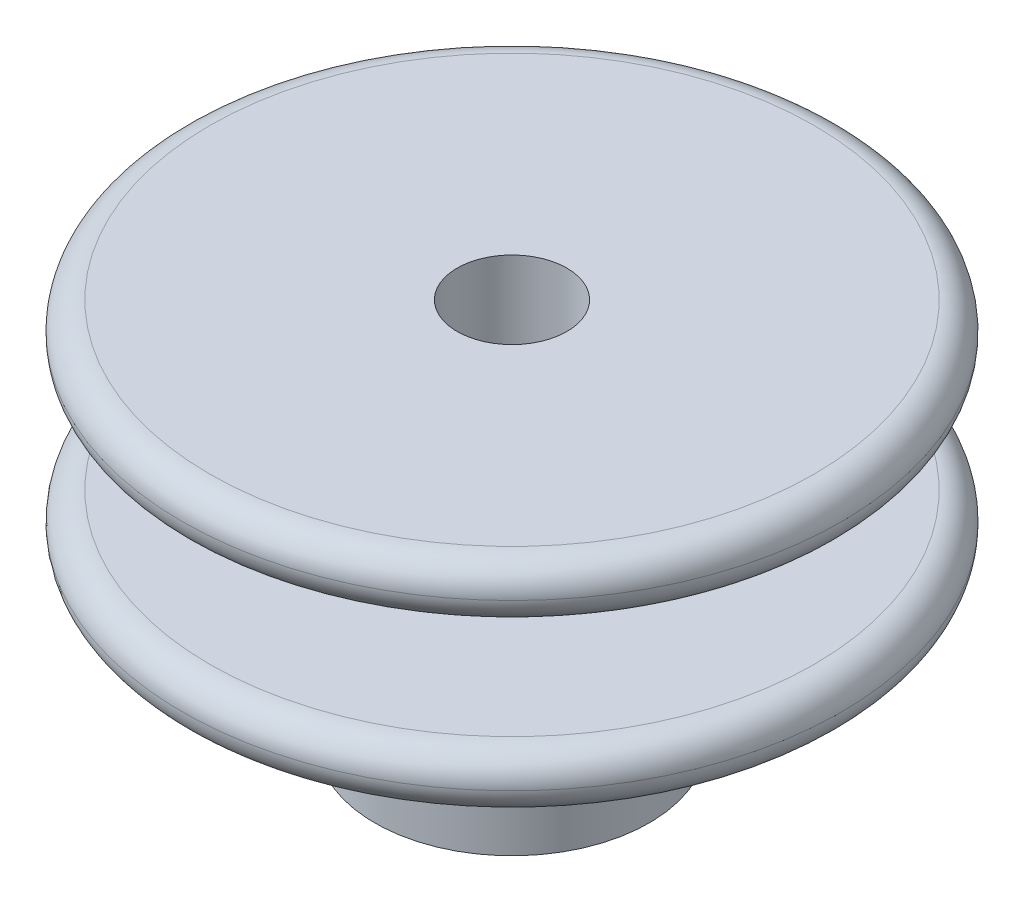
ISO-10303-21;
HEADER;
FILE_DESCRIPTION(('STEP AP214'),'2;1');
FILE_NAME('part.step','',(''),(''),'','','');
FILE_SCHEMA(('AUTOMOTIVE_DESIGN { 1 0 10303 214 1 1 1 1 }'));
ENDSEC;
DATA;
#1=APPLICATION_CONTEXT('core data for automotive mechanical design processes');
#2=APPLICATION_PROTOCOL_DEFINITION('international standard','automotive_design',2000,#1);
#3=PRODUCT_CONTEXT('',#1,'mechanical');
#4=PRODUCT('Part','Part','',(#3));
#5=PRODUCT_RELATED_PRODUCT_CATEGORY('part','',(#4));
#6=PRODUCT_DEFINITION_FORMATION('','',#4);
#7=PRODUCT_DEFINITION_CONTEXT('part definition',#1,'design');
#8=PRODUCT_DEFINITION('design','',#6,#7);
#9=PRODUCT_DEFINITION_SHAPE('','',#8);
#10=(LENGTH_UNIT() NAMED_UNIT(*) SI_UNIT(.MILLI.,.METRE.));
#11=(NAMED_UNIT(*) PLANE_ANGLE_UNIT() SI_UNIT($,.RADIAN.));
#12=(NAMED_UNIT(*) SI_UNIT($,.STERADIAN.) SOLID_ANGLE_UNIT());
#13=UNCERTAINTY_MEASURE_WITH_UNIT(LENGTH_MEASURE(1.E-05),#10,'distance_accuracy_value','');
#14=(GEOMETRIC_REPRESENTATION_CONTEXT(3) GLOBAL_UNCERTAINTY_ASSIGNED_CONTEXT((#13)) GLOBAL_UNIT_ASSIGNED_CONTEXT((#10,
#11,#12)) REPRESENTATION_CONTEXT('',''));
#15=CARTESIAN_POINT('',(0.,0.,0.));
#16=DIRECTION('',(0.,0.,1.));
#17=DIRECTION('',(1.,0.,0.));
#18=AXIS2_PLACEMENT_3D('',#15,#16,#17);
#19=CARTESIAN_POINT('',(0.,4.,0.));
#20=DIRECTION('',(0.,-1.,0.));
#21=DIRECTION('',(0.,0.,-1.));
#22=AXIS2_PLACEMENT_3D('',#19,#20,#21);
#23=CYLINDRICAL_SURFACE('',#22,5.);
#24=CARTESIAN_POINT('',(0.,4.,0.));
#25=DIRECTION('',(0.,1.,0.));
#26=DIRECTION('',(0.,0.,1.));
#27=AXIS2_PLACEMENT_3D('',#24,#25,#26);
#28=CIRCLE('',#27,5.);
#29=CARTESIAN_POINT('',(0.,4.,5.));
#30=VERTEX_POINT('',#29);
#31=EDGE_CURVE('E137',#30,#30,#28,.T.);
#32=ORIENTED_EDGE('',*,*,#31,.F.);
#33=EDGE_LOOP('',(#32));
#34=FACE_BOUND('',#33,.T.);
#35=CARTESIAN_POINT('',(0.,0.,0.));
#36=DIRECTION('',(0.,1.,0.));
#37=DIRECTION('',(0.,0.,1.));
#38=AXIS2_PLACEMENT_3D('',#35,#36,#37);
#39=CIRCLE('',#38,5.);
#40=CARTESIAN_POINT('',(0.,0.,5.));
#41=VERTEX_POINT('',#40);
#42=EDGE_CURVE('E135',#41,#41,#39,.T.);
#43=ORIENTED_EDGE('',*,*,#42,.T.);
#44=EDGE_LOOP('',(#43));
#45=FACE_BOUND('',#44,.T.);
#46=ADVANCED_FACE('F39',(#34,#45),#23,.T.);
#47=CARTESIAN_POINT('',(0.,6.,0.));
#48=DIRECTION('',(0.,1.,0.));
#49=DIRECTION('',(0.,0.,1.));
#50=AXIS2_PLACEMENT_3D('',#47,#48,#49);
#51=PLANE('',#50);
#52=CARTESIAN_POINT('',(0.,6.,0.));
#53=DIRECTION('',(0.,1.,0.));
#54=DIRECTION('',(0.,0.,1.));
#55=AXIS2_PLACEMENT_3D('',#52,#53,#54);
#56=CIRCLE('',#55,11.);
#57=CARTESIAN_POINT('',(0.,6.,11.));
#58=VERTEX_POINT('',#57);
#59=EDGE_CURVE('E48',#58,#58,#56,.T.);
#60=ORIENTED_EDGE('',*,*,#59,.T.);
#61=EDGE_LOOP('',(#60));
#62=FACE_BOUND('',#61,.T.);
#63=CARTESIAN_POINT('',(0.,6.,0.));
#64=DIRECTION('',(0.,-1.,0.));
#65=DIRECTION('',(0.,0.,-1.));
#66=AXIS2_PLACEMENT_3D('',#63,#64,#65);
#67=CIRCLE('',#66,2.);
#68=CARTESIAN_POINT('',(0.,6.,-2.));
#69=VERTEX_POINT('',#68);
#70=EDGE_CURVE('E66',#69,#69,#67,.T.);
#71=ORIENTED_EDGE('',*,*,#70,.T.);
#72=EDGE_LOOP('',(#71));
#73=FACE_BOUND('',#72,.T.);
#74=ADVANCED_FACE('F86',(#62,#73),#51,.T.);
#75=CARTESIAN_POINT('',(0.,4.,0.));
#76=DIRECTION('',(0.,1.,0.));
#77=DIRECTION('',(0.,0.,1.));
#78=AXIS2_PLACEMENT_3D('',#75,#76,#77);
#79=PLANE('',#78);
#80=CARTESIAN_POINT('',(0.,4.,0.));
#81=DIRECTION('',(0.,1.,0.));
#82=DIRECTION('',(0.,0.,1.));
#83=AXIS2_PLACEMENT_3D('',#80,#81,#82);
#84=CIRCLE('',#83,11.);
#85=CARTESIAN_POINT('',(0.,4.,11.));
#86=VERTEX_POINT('',#85);
#87=EDGE_CURVE('E54',#86,#86,#84,.F.);
#88=ORIENTED_EDGE('',*,*,#87,.T.);
#89=EDGE_LOOP('',(#88));
#90=FACE_BOUND('',#89,.T.);
#91=ORIENTED_EDGE('',*,*,#31,.T.);
#92=EDGE_LOOP('',(#91));
#93=FACE_BOUND('',#92,.T.);
#94=ADVANCED_FACE('F92',(#90,#93),#79,.F.);
#95=CARTESIAN_POINT('',(0.,-2.,0.));
#96=DIRECTION('',(0.,-1.,0.));
#97=DIRECTION('',(0.,0.,-1.));
#98=AXIS2_PLACEMENT_3D('',#95,#96,#97);
#99=PLANE('',#98);
#100=CARTESIAN_POINT('',(0.,-2.,0.));
#101=DIRECTION('',(0.,-1.,0.));
#102=DIRECTION('',(0.,0.,-1.));
#103=AXIS2_PLACEMENT_3D('',#100,#101,#102);
#104=CIRCLE('',#103,11.);
#105=CARTESIAN_POINT('',(0.,-2.,-11.));
#106=VERTEX_POINT('',#105);
#107=EDGE_CURVE('E10',#106,#106,#104,.T.);
#108=ORIENTED_EDGE('',*,*,#107,.T.);
#109=EDGE_LOOP('',(#108));
#110=FACE_BOUND('',#109,.T.);
#111=CARTESIAN_POINT('',(0.,-2.,0.));
#112=DIRECTION('',(0.,-1.,0.));
#113=DIRECTION('',(0.,0.,-1.));
#114=AXIS2_PLACEMENT_3D('',#111,#112,#113);
#115=CIRCLE('',#114,5.);
#116=CARTESIAN_POINT('',(0.,-2.,-5.));
#117=VERTEX_POINT('',#116);
#118=EDGE_CURVE('E143',#117,#117,#115,.T.);
#119=ORIENTED_EDGE('',*,*,#118,.F.);
#120=EDGE_LOOP('',(#119));
#121=FACE_BOUND('',#120,.T.);
#122=ADVANCED_FACE('F122',(#110,#121),#99,.T.);
#123=CARTESIAN_POINT('',(0.,0.,0.));
#124=DIRECTION('',(0.,-1.,0.));
#125=DIRECTION('',(0.,0.,-1.));
#126=AXIS2_PLACEMENT_3D('',#123,#124,#125);
#127=PLANE('',#126);
#128=CARTESIAN_POINT('',(0.,0.,0.));
#129=DIRECTION('',(0.,-1.,0.));
#130=DIRECTION('',(0.,0.,-1.));
#131=AXIS2_PLACEMENT_3D('',#128,#129,#130);
#132=CIRCLE('',#131,11.);
#133=CARTESIAN_POINT('',(0.,0.,-11.));
#134=VERTEX_POINT('',#133);
#135=EDGE_CURVE('E132',#134,#134,#132,.F.);
#136=ORIENTED_EDGE('',*,*,#135,.T.);
#137=EDGE_LOOP('',(#136));
#138=FACE_BOUND('',#137,.T.);
#139=ORIENTED_EDGE('',*,*,#42,.F.);
#140=EDGE_LOOP('',(#139));
#141=FACE_BOUND('',#140,.T.);
#142=ADVANCED_FACE('F120',(#138,#141),#127,.F.);
#143=CARTESIAN_POINT('',(0.,-8.,0.));
#144=DIRECTION('',(0.,1.,0.));
#145=DIRECTION('',(0.,0.,1.));
#146=AXIS2_PLACEMENT_3D('',#143,#144,#145);
#147=CYLINDRICAL_SURFACE('',#146,5.);
#148=CARTESIAN_POINT('',(0.,-8.,0.));
#149=DIRECTION('',(0.,-1.,0.));
#150=DIRECTION('',(0.,0.,-1.));
#151=AXIS2_PLACEMENT_3D('',#148,#149,#150);
#152=CIRCLE('',#151,5.);
#153=CARTESIAN_POINT('',(0.,-8.,-5.));
#154=VERTEX_POINT('',#153);
#155=EDGE_CURVE('E138',#154,#154,#152,.T.);
#156=ORIENTED_EDGE('',*,*,#155,.F.);
#157=EDGE_LOOP('',(#156));
#158=FACE_BOUND('',#157,.T.);
#159=ORIENTED_EDGE('',*,*,#118,.T.);
#160=EDGE_LOOP('',(#159));
#161=FACE_BOUND('',#160,.T.);
#162=ADVANCED_FACE('F112',(#158,#161),#147,.T.);
#163=CARTESIAN_POINT('',(0.,-8.,0.));
#164=DIRECTION('',(0.,-1.,0.));
#165=DIRECTION('',(0.,0.,-1.));
#166=AXIS2_PLACEMENT_3D('',#163,#164,#165);
#167=PLANE('',#166);
#168=CARTESIAN_POINT('',(0.,-8.,0.));
#169=DIRECTION('',(0.,-1.,0.));
#170=DIRECTION('',(0.,0.,-1.));
#171=AXIS2_PLACEMENT_3D('',#168,#169,#170);
#172=CIRCLE('',#171,2.);
#173=CARTESIAN_POINT('',(0.,-8.,-2.));
#174=VERTEX_POINT('',#173);
#175=EDGE_CURVE('E60',#174,#174,#172,.T.);
#176=ORIENTED_EDGE('',*,*,#175,.F.);
#177=EDGE_LOOP('',(#176));
#178=FACE_BOUND('',#177,.T.);
#179=ORIENTED_EDGE('',*,*,#155,.T.);
#180=EDGE_LOOP('',(#179));
#181=FACE_BOUND('',#180,.T.);
#182=ADVANCED_FACE('F105',(#178,#181),#167,.T.);
#183=CARTESIAN_POINT('',(0.,6.,0.));
#184=DIRECTION('',(0.,-1.,0.));
#185=DIRECTION('',(0.,0.,-1.));
#186=AXIS2_PLACEMENT_3D('',#183,#184,#185);
#187=CYLINDRICAL_SURFACE('',#186,2.);
#188=ORIENTED_EDGE('',*,*,#70,.F.);
#189=EDGE_LOOP('',(#188));
#190=FACE_BOUND('',#189,.T.);
#191=ORIENTED_EDGE('',*,*,#175,.T.);
#192=EDGE_LOOP('',(#191));
#193=FACE_BOUND('',#192,.T.);
#194=ADVANCED_FACE('F100',(#190,#193),#187,.F.);
#195=CARTESIAN_POINT('',(0.,-1.,0.));
#196=DIRECTION('',(0.,-1.,0.));
#197=DIRECTION('',(0.,0.,-1.));
#198=AXIS2_PLACEMENT_3D('',#195,#196,#197);
#199=TOROIDAL_SURFACE('',#198,11.,1.);
#200=ORIENTED_EDGE('',*,*,#107,.F.);
#201=EDGE_LOOP('',(#200));
#202=FACE_BOUND('',#201,.T.);
#203=CARTESIAN_POINT('',(0.,-1.,0.));
#204=DIRECTION('',(0.,-1.,0.));
#205=DIRECTION('',(0.,0.,-1.));
#206=AXIS2_PLACEMENT_3D('',#203,#204,#205);
#207=CIRCLE('',#206,12.);
#208=CARTESIAN_POINT('',(0.,-1.,-12.));
#209=VERTEX_POINT('',#208);
#210=EDGE_CURVE('E57',#209,#209,#207,.F.);
#211=ORIENTED_EDGE('',*,*,#210,.F.);
#212=EDGE_LOOP('',(#211));
#213=FACE_BOUND('',#212,.T.);
#214=ADVANCED_FACE('F81',(#202,#213),#199,.T.);
#215=CARTESIAN_POINT('',(0.,-1.,0.));
#216=DIRECTION('',(0.,-1.,0.));
#217=DIRECTION('',(0.,0.,-1.));
#218=AXIS2_PLACEMENT_3D('',#215,#216,#217);
#219=TOROIDAL_SURFACE('',#218,11.,1.);
#220=ORIENTED_EDGE('',*,*,#135,.F.);
#221=EDGE_LOOP('',(#220));
#222=FACE_BOUND('',#221,.T.);
#223=ORIENTED_EDGE('',*,*,#210,.T.);
#224=EDGE_LOOP('',(#223));
#225=FACE_BOUND('',#224,.T.);
#226=ADVANCED_FACE('F74',(#222,#225),#219,.T.);
#227=CARTESIAN_POINT('',(0.,5.,0.));
#228=DIRECTION('',(0.,1.,0.));
#229=DIRECTION('',(0.,0.,1.));
#230=AXIS2_PLACEMENT_3D('',#227,#228,#229);
#231=TOROIDAL_SURFACE('',#230,11.,1.);
#232=ORIENTED_EDGE('',*,*,#59,.F.);
#233=EDGE_LOOP('',(#232));
#234=FACE_BOUND('',#233,.T.);
#235=CARTESIAN_POINT('',(0.,5.,0.));
#236=DIRECTION('',(0.,1.,0.));
#237=DIRECTION('',(0.,0.,1.));
#238=AXIS2_PLACEMENT_3D('',#235,#236,#237);
#239=CIRCLE('',#238,12.);
#240=CARTESIAN_POINT('',(0.,5.,12.));
#241=VERTEX_POINT('',#240);
#242=EDGE_CURVE('E43',#241,#241,#239,.F.);
#243=ORIENTED_EDGE('',*,*,#242,.F.);
#244=EDGE_LOOP('',(#243));
#245=FACE_BOUND('',#244,.T.);
#246=ADVANCED_FACE('F41',(#234,#245),#231,.T.);
#247=CARTESIAN_POINT('',(0.,5.,0.));
#248=DIRECTION('',(0.,1.,0.));
#249=DIRECTION('',(0.,0.,1.));
#250=AXIS2_PLACEMENT_3D('',#247,#248,#249);
#251=TOROIDAL_SURFACE('',#250,11.,1.);
#252=ORIENTED_EDGE('',*,*,#87,.F.);
#253=EDGE_LOOP('',(#252));
#254=FACE_BOUND('',#253,.T.);
#255=ORIENTED_EDGE('',*,*,#242,.T.);
#256=EDGE_LOOP('',(#255));
#257=FACE_BOUND('',#256,.T.);
#258=ADVANCED_FACE('F71',(#254,#257),#251,.T.);
#259=CLOSED_SHELL('',(#46,#74,#94,#122,#142,#162,#182,#194,#214,#226,#246,#258));
#260=MANIFOLD_SOLID_BREP('B2',#259);
#261=ADVANCED_BREP_SHAPE_REPRESENTATION('',(#18,#260),#14);
#262=SHAPE_DEFINITION_REPRESENTATION(#9,#261);
ENDSEC;
END-ISO-10303-21;
